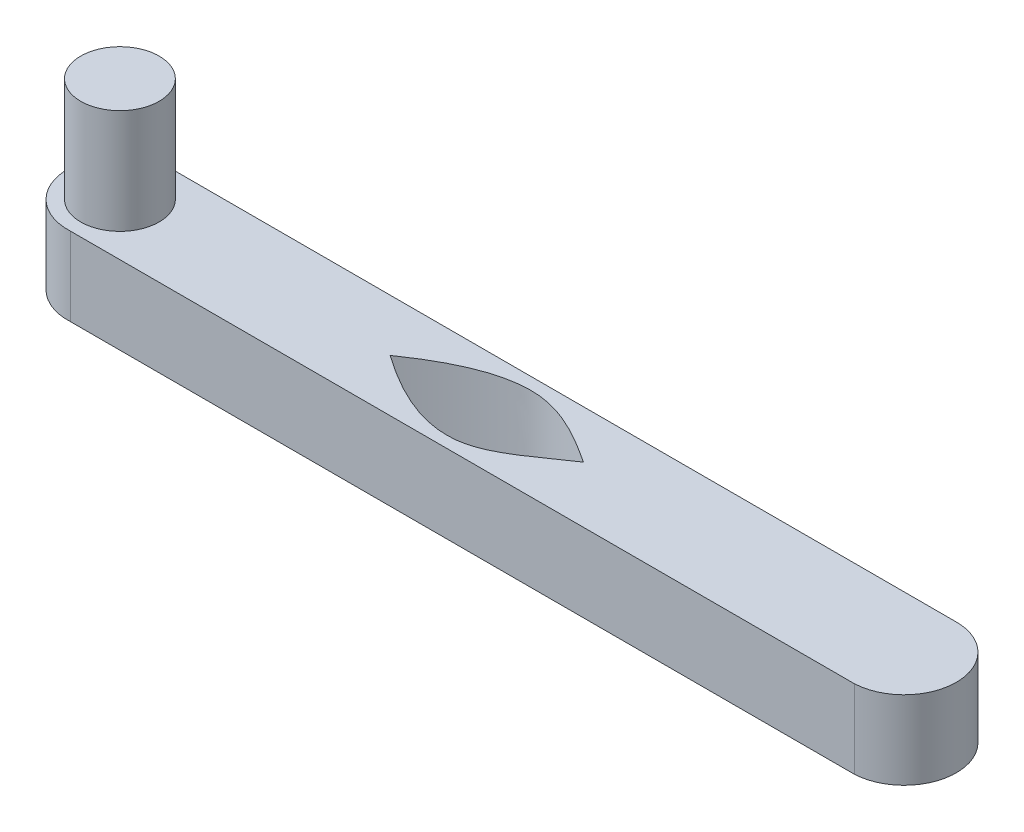
ISO-10303-21;
HEADER;
FILE_DESCRIPTION(('STEP AP214'),'2;1');
FILE_NAME('part.step','',(''),(''),'','','');
FILE_SCHEMA(('AUTOMOTIVE_DESIGN { 1 0 10303 214 1 1 1 1 }'));
ENDSEC;
DATA;
#1=APPLICATION_CONTEXT('core data for automotive mechanical design processes');
#2=APPLICATION_PROTOCOL_DEFINITION('international standard','automotive_design',2000,#1);
#3=PRODUCT_CONTEXT('',#1,'mechanical');
#4=PRODUCT('Part','Part','',(#3));
#5=PRODUCT_RELATED_PRODUCT_CATEGORY('part','',(#4));
#6=PRODUCT_DEFINITION_FORMATION('','',#4);
#7=PRODUCT_DEFINITION_CONTEXT('part definition',#1,'design');
#8=PRODUCT_DEFINITION('design','',#6,#7);
#9=PRODUCT_DEFINITION_SHAPE('','',#8);
#10=(LENGTH_UNIT() NAMED_UNIT(*) SI_UNIT(.MILLI.,.METRE.));
#11=(NAMED_UNIT(*) PLANE_ANGLE_UNIT() SI_UNIT($,.RADIAN.));
#12=(NAMED_UNIT(*) SI_UNIT($,.STERADIAN.) SOLID_ANGLE_UNIT());
#13=UNCERTAINTY_MEASURE_WITH_UNIT(LENGTH_MEASURE(1.E-05),#10,'distance_accuracy_value','');
#14=(GEOMETRIC_REPRESENTATION_CONTEXT(3) GLOBAL_UNCERTAINTY_ASSIGNED_CONTEXT((#13)) GLOBAL_UNIT_ASSIGNED_CONTEXT((#10,
#11,#12)) REPRESENTATION_CONTEXT('',''));
#15=CARTESIAN_POINT('',(0.,0.,0.));
#16=DIRECTION('',(0.,0.,1.));
#17=DIRECTION('',(1.,0.,0.));
#18=AXIS2_PLACEMENT_3D('',#15,#16,#17);
#19=CARTESIAN_POINT('',(0.,38.1,0.));
#20=DIRECTION('',(0.,1.,0.));
#21=DIRECTION('',(0.,0.,1.));
#22=AXIS2_PLACEMENT_3D('',#19,#20,#21);
#23=PLANE('',#22);
#24=CARTESIAN_POINT('',(0.,38.1,-25.36825));
#25=CARTESIAN_POINT('',(25.5963958252859,38.1,-61.5196106479018));
#26=CARTESIAN_POINT('',(58.6773186494475,38.1,-27.3726781510493));
#27=CARTESIAN_POINT('',(118.362782549493,38.1,4.35583137095098));
#28=CARTESIAN_POINT('',(170.473666471598,38.1,-37.801487315961));
#29=CARTESIAN_POINT('',(214.204958372178,38.1,-57.3627297547905));
#30=CARTESIAN_POINT('',(239.392678616694,38.1,-25.36825));
#31=B_SPLINE_CURVE_WITH_KNOTS('',3,(#24,#25,#26,#27,#28,#29,#30),.UNSPECIFIED.,.F.,.F.,(4,1,1,1,
4),(0.,0.293535528476679,0.509769313424357,0.658147643170667,1.),.UNSPECIFIED.);
#32=CARTESIAN_POINT('',(68.0533826437841,38.1,-25.3682499981661));
#33=VERTEX_POINT('',#32);
#34=CARTESIAN_POINT('',(159.945271560049,38.1,-27.422727744916));
#35=VERTEX_POINT('',#34);
#36=EDGE_CURVE('E98',#33,#35,#31,.T.);
#37=ORIENTED_EDGE('',*,*,#36,.F.);
#38=CARTESIAN_POINT('',(0.,38.1,-25.36825));
#39=CARTESIAN_POINT('',(25.3351872059456,38.1,11.2056176959292));
#40=CARTESIAN_POINT('',(59.2664813672699,38.1,-24.3167972957163));
#41=CARTESIAN_POINT('',(147.333316585039,38.1,-68.3318332741785));
#42=CARTESIAN_POINT('',(200.091851187685,38.1,25.9181581188524));
#43=CARTESIAN_POINT('',(239.392678616694,38.1,-25.36825));
#44=B_SPLINE_CURVE_WITH_KNOTS('',3,(#38,#39,#40,#41,#42,#43),.UNSPECIFIED.,.F.,.F.,(4,1,1,4),
(0.,0.293668056423848,0.509999468462109,1.),.UNSPECIFIED.);
#45=EDGE_CURVE('E51',#33,#35,#44,.T.);
#46=ORIENTED_EDGE('',*,*,#45,.T.);
#47=EDGE_LOOP('',(#37,#46));
#48=FACE_BOUND('',#47,.T.);
#49=CARTESIAN_POINT('',(317.78178125,38.1,-25.36825));
#50=DIRECTION('',(0.,1.,0.));
#51=DIRECTION('',(0.,0.,1.));
#52=AXIS2_PLACEMENT_3D('',#49,#50,#51);
#53=CIRCLE('',#52,25.399492876882);
#54=CARTESIAN_POINT('',(316.522364583334,38.1,-50.7365));
#55=VERTEX_POINT('',#54);
#56=CARTESIAN_POINT('',(319.041197916667,38.1,0.));
#57=VERTEX_POINT('',#56);
#58=EDGE_CURVE('E155',#55,#57,#53,.F.);
#59=ORIENTED_EDGE('',*,*,#58,.F.);
#60=DIRECTION('',(1.,0.,0.));
#61=VECTOR('',#60,1.);
#62=CARTESIAN_POINT('',(0.,38.1,-50.7365));
#63=LINE('',#62,#61);
#64=CARTESIAN_POINT('',(-64.4776354166665,38.1,-50.7365));
#65=VERTEX_POINT('',#64);
#66=EDGE_CURVE('E168',#65,#55,#63,.T.);
#67=ORIENTED_EDGE('',*,*,#66,.F.);
#68=CARTESIAN_POINT('',(-63.21821875,38.1,-25.36825));
#69=DIRECTION('',(0.,1.,0.));
#70=DIRECTION('',(0.,0.,1.));
#71=AXIS2_PLACEMENT_3D('',#68,#69,#70);
#72=CIRCLE('',#71,25.399492876882);
#73=CARTESIAN_POINT('',(-61.9588020833333,38.1,0.));
#74=VERTEX_POINT('',#73);
#75=EDGE_CURVE('E165',#74,#65,#72,.F.);
#76=ORIENTED_EDGE('',*,*,#75,.F.);
#77=DIRECTION('',(1.,0.,0.));
#78=VECTOR('',#77,1.);
#79=CARTESIAN_POINT('',(0.,38.1,0.));
#80=LINE('',#79,#78);
#81=EDGE_CURVE('E162',#74,#57,#80,.T.);
#82=ORIENTED_EDGE('',*,*,#81,.T.);
#83=EDGE_LOOP('',(#59,#67,#76,#82));
#84=FACE_BOUND('',#83,.T.);
#85=CARTESIAN_POINT('',(-63.21821875,38.1,-25.36825));
#86=DIRECTION('',(0.,1.,0.));
#87=DIRECTION('',(0.,0.,1.));
#88=AXIS2_PLACEMENT_3D('',#85,#86,#87);
#89=CIRCLE('',#88,19.05);
#90=CARTESIAN_POINT('',(-63.21821875,38.1,-6.31824999999999));
#91=VERTEX_POINT('',#90);
#92=EDGE_CURVE('E105',#91,#91,#89,.T.);
#93=ORIENTED_EDGE('',*,*,#92,.F.);
#94=EDGE_LOOP('',(#93));
#95=FACE_BOUND('',#94,.T.);
#96=ADVANCED_FACE('F36',(#48,#84,#95),#23,.T.);
#97=CARTESIAN_POINT('',(0.,0.,0.));
#98=DIRECTION('',(0.,1.,0.));
#99=DIRECTION('',(0.,0.,1.));
#100=AXIS2_PLACEMENT_3D('',#97,#98,#99);
#101=PLANE('',#100);
#102=CARTESIAN_POINT('',(317.78178125,0.,-25.36825));
#103=DIRECTION('',(0.,1.,0.));
#104=DIRECTION('',(0.,0.,1.));
#105=AXIS2_PLACEMENT_3D('',#102,#103,#104);
#106=CIRCLE('',#105,25.399492876882);
#107=CARTESIAN_POINT('',(316.522364583334,0.,-50.7365));
#108=VERTEX_POINT('',#107);
#109=CARTESIAN_POINT('',(319.041197916667,0.,0.));
#110=VERTEX_POINT('',#109);
#111=EDGE_CURVE('E148',#108,#110,#106,.F.);
#112=ORIENTED_EDGE('',*,*,#111,.T.);
#113=DIRECTION('',(1.,0.,0.));
#114=VECTOR('',#113,1.);
#115=CARTESIAN_POINT('',(0.,0.,0.));
#116=LINE('',#115,#114);
#117=CARTESIAN_POINT('',(-61.9588020833333,0.,0.));
#118=VERTEX_POINT('',#117);
#119=EDGE_CURVE('E153',#118,#110,#116,.T.);
#120=ORIENTED_EDGE('',*,*,#119,.F.);
#121=CARTESIAN_POINT('',(-63.21821875,0.,-25.36825));
#122=DIRECTION('',(0.,1.,0.));
#123=DIRECTION('',(0.,0.,1.));
#124=AXIS2_PLACEMENT_3D('',#121,#122,#123);
#125=CIRCLE('',#124,25.399492876882);
#126=CARTESIAN_POINT('',(-64.4776354166665,0.,-50.7365));
#127=VERTEX_POINT('',#126);
#128=EDGE_CURVE('E147',#118,#127,#125,.F.);
#129=ORIENTED_EDGE('',*,*,#128,.T.);
#130=DIRECTION('',(1.,0.,0.));
#131=VECTOR('',#130,1.);
#132=CARTESIAN_POINT('',(0.,0.,-50.7365));
#133=LINE('',#132,#131);
#134=EDGE_CURVE('E141',#127,#108,#133,.T.);
#135=ORIENTED_EDGE('',*,*,#134,.T.);
#136=EDGE_LOOP('',(#112,#120,#129,#135));
#137=FACE_BOUND('',#136,.T.);
#138=CARTESIAN_POINT('',(0.,0.,-25.36825));
#139=CARTESIAN_POINT('',(25.3351872059456,0.,11.2056176959292));
#140=CARTESIAN_POINT('',(59.2664813672699,0.,-24.3167972957163));
#141=CARTESIAN_POINT('',(147.333316585039,0.,-68.3318332741785));
#142=CARTESIAN_POINT('',(200.091851187685,0.,25.9181581188524));
#143=CARTESIAN_POINT('',(239.392678616694,0.,-25.36825));
#144=B_SPLINE_CURVE_WITH_KNOTS('',3,(#138,#139,#140,#141,#142,#143),.UNSPECIFIED.,.F.,.F.,(4,1,
1,4),(0.,0.293668056423848,0.509999468462109,1.),.UNSPECIFIED.);
#145=CARTESIAN_POINT('',(68.05338264378,0.,-25.368249998169));
#146=VERTEX_POINT('',#145);
#147=CARTESIAN_POINT('',(159.945271560048,0.,-27.4227277449155));
#148=VERTEX_POINT('',#147);
#149=EDGE_CURVE('E89',#146,#148,#144,.T.);
#150=ORIENTED_EDGE('',*,*,#149,.F.);
#151=CARTESIAN_POINT('',(0.,0.,-25.36825));
#152=CARTESIAN_POINT('',(25.5963958252859,0.,-61.5196106479018));
#153=CARTESIAN_POINT('',(58.6773186494475,0.,-27.3726781510493));
#154=CARTESIAN_POINT('',(118.362782549493,0.,4.35583137095098));
#155=CARTESIAN_POINT('',(170.473666471598,0.,-37.801487315961));
#156=CARTESIAN_POINT('',(214.204958372178,0.,-57.3627297547905));
#157=CARTESIAN_POINT('',(239.392678616694,0.,-25.36825));
#158=B_SPLINE_CURVE_WITH_KNOTS('',3,(#151,#152,#153,#154,#155,#156,#157),.UNSPECIFIED.,.F.,.F.,
(4,1,1,1,4),(0.,0.293535528476679,0.509769313424357,0.658147643170667,1.),.UNSPECIFIED.);
#159=EDGE_CURVE('E92',#146,#148,#158,.T.);
#160=ORIENTED_EDGE('',*,*,#159,.T.);
#161=EDGE_LOOP('',(#150,#160));
#162=FACE_BOUND('',#161,.T.);
#163=ADVANCED_FACE('F97',(#137,#162),#101,.F.);
#164=CARTESIAN_POINT('',(317.78178125,38.1,-25.36825));
#165=DIRECTION('',(0.,-1.,0.));
#166=DIRECTION('',(0.,0.,-1.));
#167=AXIS2_PLACEMENT_3D('',#164,#165,#166);
#168=CYLINDRICAL_SURFACE('',#167,25.399492876882);
#169=ORIENTED_EDGE('',*,*,#111,.F.);
#170=DIRECTION('',(0.,-1.,0.));
#171=VECTOR('',#170,1.);
#172=CARTESIAN_POINT('',(316.522364583334,38.1,-50.7365));
#173=LINE('',#172,#171);
#174=EDGE_CURVE('E11',#55,#108,#173,.T.);
#175=ORIENTED_EDGE('',*,*,#174,.F.);
#176=ORIENTED_EDGE('',*,*,#58,.T.);
#177=DIRECTION('',(0.,-1.,0.));
#178=VECTOR('',#177,1.);
#179=CARTESIAN_POINT('',(319.041197916667,38.1,0.));
#180=LINE('',#179,#178);
#181=EDGE_CURVE('E159',#57,#110,#180,.T.);
#182=ORIENTED_EDGE('',*,*,#181,.T.);
#183=EDGE_LOOP('',(#169,#175,#176,#182));
#184=FACE_BOUND('',#183,.T.);
#185=ADVANCED_FACE('F38',(#184),#168,.T.);
#186=CARTESIAN_POINT('',(0.,38.1,-50.7365));
#187=DIRECTION('',(0.,0.,-1.));
#188=DIRECTION('',(-1.,0.,0.));
#189=AXIS2_PLACEMENT_3D('',#186,#187,#188);
#190=PLANE('',#189);
#191=ORIENTED_EDGE('',*,*,#134,.F.);
#192=DIRECTION('',(0.,-1.,0.));
#193=VECTOR('',#192,1.);
#194=CARTESIAN_POINT('',(-64.4776354166665,38.1,-50.7365));
#195=LINE('',#194,#193);
#196=EDGE_CURVE('E44',#65,#127,#195,.T.);
#197=ORIENTED_EDGE('',*,*,#196,.F.);
#198=ORIENTED_EDGE('',*,*,#66,.T.);
#199=ORIENTED_EDGE('',*,*,#174,.T.);
#200=EDGE_LOOP('',(#191,#197,#198,#199));
#201=FACE_BOUND('',#200,.T.);
#202=ADVANCED_FACE('F131',(#201),#190,.T.);
#203=CARTESIAN_POINT('',(-63.21821875,38.1,-25.36825));
#204=DIRECTION('',(0.,-1.,0.));
#205=DIRECTION('',(0.,0.,-1.));
#206=AXIS2_PLACEMENT_3D('',#203,#204,#205);
#207=CYLINDRICAL_SURFACE('',#206,25.399492876882);
#208=ORIENTED_EDGE('',*,*,#128,.F.);
#209=DIRECTION('',(0.,-1.,0.));
#210=VECTOR('',#209,1.);
#211=CARTESIAN_POINT('',(-61.9588020833333,38.1,0.));
#212=LINE('',#211,#210);
#213=EDGE_CURVE('E161',#74,#118,#212,.T.);
#214=ORIENTED_EDGE('',*,*,#213,.F.);
#215=ORIENTED_EDGE('',*,*,#75,.T.);
#216=ORIENTED_EDGE('',*,*,#196,.T.);
#217=EDGE_LOOP('',(#208,#214,#215,#216));
#218=FACE_BOUND('',#217,.T.);
#219=ADVANCED_FACE('F128',(#218),#207,.T.);
#220=CARTESIAN_POINT('',(0.,38.1,0.));
#221=DIRECTION('',(0.,0.,-1.));
#222=DIRECTION('',(-1.,0.,0.));
#223=AXIS2_PLACEMENT_3D('',#220,#221,#222);
#224=PLANE('',#223);
#225=ORIENTED_EDGE('',*,*,#119,.T.);
#226=ORIENTED_EDGE('',*,*,#181,.F.);
#227=ORIENTED_EDGE('',*,*,#81,.F.);
#228=ORIENTED_EDGE('',*,*,#213,.T.);
#229=EDGE_LOOP('',(#225,#226,#227,#228));
#230=FACE_BOUND('',#229,.T.);
#231=ADVANCED_FACE('F118',(#230),#224,.F.);
#232=DIRECTION('',(0.,1.,0.));
#233=VECTOR('',#232,1.);
#234=SURFACE_OF_LINEAR_EXTRUSION('',#144,#233);
#235=ORIENTED_EDGE('',*,*,#45,.F.);
#236=DIRECTION('',(0.,1.,0.));
#237=VECTOR('',#236,1.);
#238=CARTESIAN_POINT('',(68.05338264378,0.,-25.368249998169));
#239=LINE('',#238,#237);
#240=EDGE_CURVE('E86',#146,#33,#239,.T.);
#241=ORIENTED_EDGE('',*,*,#240,.F.);
#242=ORIENTED_EDGE('',*,*,#149,.T.);
#243=DIRECTION('',(0.,1.,0.));
#244=VECTOR('',#243,1.);
#245=CARTESIAN_POINT('',(159.945271560049,0.,-27.422727744916));
#246=LINE('',#245,#244);
#247=EDGE_CURVE('E58',#148,#35,#246,.T.);
#248=ORIENTED_EDGE('',*,*,#247,.T.);
#249=EDGE_LOOP('',(#235,#241,#242,#248));
#250=FACE_BOUND('',#249,.T.);
#251=ADVANCED_FACE('F87',(#250),#234,.T.);
#252=DIRECTION('',(0.,1.,0.));
#253=VECTOR('',#252,1.);
#254=SURFACE_OF_LINEAR_EXTRUSION('',#158,#253);
#255=ORIENTED_EDGE('',*,*,#36,.T.);
#256=ORIENTED_EDGE('',*,*,#247,.F.);
#257=ORIENTED_EDGE('',*,*,#159,.F.);
#258=ORIENTED_EDGE('',*,*,#240,.T.);
#259=EDGE_LOOP('',(#255,#256,#257,#258));
#260=FACE_BOUND('',#259,.T.);
#261=ADVANCED_FACE('F94',(#260),#254,.F.);
#262=CARTESIAN_POINT('',(-63.21821875,88.9,-25.36825));
#263=DIRECTION('',(0.,-1.,0.));
#264=DIRECTION('',(0.,0.,-1.));
#265=AXIS2_PLACEMENT_3D('',#262,#263,#264);
#266=CYLINDRICAL_SURFACE('',#265,19.05);
#267=CARTESIAN_POINT('',(-63.21821875,88.9,-25.36825));
#268=DIRECTION('',(0.,1.,0.));
#269=DIRECTION('',(0.,0.,1.));
#270=AXIS2_PLACEMENT_3D('',#267,#268,#269);
#271=CIRCLE('',#270,19.05);
#272=CARTESIAN_POINT('',(-63.21821875,88.9,-6.31824999999999));
#273=VERTEX_POINT('',#272);
#274=EDGE_CURVE('E183',#273,#273,#271,.T.);
#275=ORIENTED_EDGE('',*,*,#274,.F.);
#276=EDGE_LOOP('',(#275));
#277=FACE_BOUND('',#276,.T.);
#278=ORIENTED_EDGE('',*,*,#92,.T.);
#279=EDGE_LOOP('',(#278));
#280=FACE_BOUND('',#279,.T.);
#281=ADVANCED_FACE('F194',(#277,#280),#266,.T.);
#282=CARTESIAN_POINT('',(-63.21821875,88.9,-25.36825));
#283=DIRECTION('',(0.,1.,0.));
#284=DIRECTION('',(0.,0.,1.));
#285=AXIS2_PLACEMENT_3D('',#282,#283,#284);
#286=PLANE('',#285);
#287=ORIENTED_EDGE('',*,*,#274,.T.);
#288=EDGE_LOOP('',(#287));
#289=FACE_BOUND('',#288,.T.);
#290=ADVANCED_FACE('F192',(#289),#286,.T.);
#291=CLOSED_SHELL('',(#96,#163,#185,#202,#219,#231,#251,#261,#281,#290));
#292=MANIFOLD_SOLID_BREP('B2',#291);
#293=ADVANCED_BREP_SHAPE_REPRESENTATION('',(#18,#292),#14);
#294=SHAPE_DEFINITION_REPRESENTATION(#9,#293);
ENDSEC;
END-ISO-10303-21;
